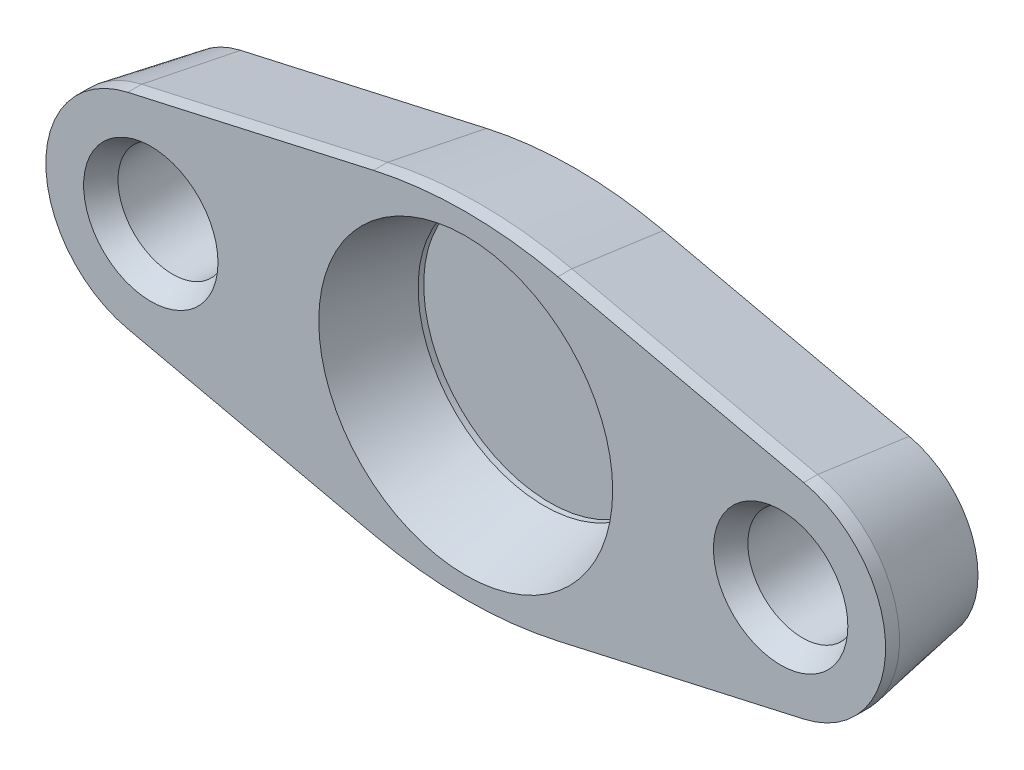
ISO-10303-21;
HEADER;
FILE_DESCRIPTION(('STEP AP214'),'2;1');
FILE_NAME('part.step','',(''),(''),'','','');
FILE_SCHEMA(('AUTOMOTIVE_DESIGN { 1 0 10303 214 1 1 1 1 }'));
ENDSEC;
DATA;
#1=APPLICATION_CONTEXT('core data for automotive mechanical design processes');
#2=APPLICATION_PROTOCOL_DEFINITION('international standard','automotive_design',2000,#1);
#3=PRODUCT_CONTEXT('',#1,'mechanical');
#4=PRODUCT('Part','Part','',(#3));
#5=PRODUCT_RELATED_PRODUCT_CATEGORY('part','',(#4));
#6=PRODUCT_DEFINITION_FORMATION('','',#4);
#7=PRODUCT_DEFINITION_CONTEXT('part definition',#1,'design');
#8=PRODUCT_DEFINITION('design','',#6,#7);
#9=PRODUCT_DEFINITION_SHAPE('','',#8);
#10=(LENGTH_UNIT() NAMED_UNIT(*) SI_UNIT(.MILLI.,.METRE.));
#11=(NAMED_UNIT(*) PLANE_ANGLE_UNIT() SI_UNIT($,.RADIAN.));
#12=(NAMED_UNIT(*) SI_UNIT($,.STERADIAN.) SOLID_ANGLE_UNIT());
#13=UNCERTAINTY_MEASURE_WITH_UNIT(LENGTH_MEASURE(1.E-05),#10,'distance_accuracy_value','');
#14=(GEOMETRIC_REPRESENTATION_CONTEXT(3) GLOBAL_UNCERTAINTY_ASSIGNED_CONTEXT((#13)) GLOBAL_UNIT_ASSIGNED_CONTEXT((#10,
#11,#12)) REPRESENTATION_CONTEXT('',''));
#15=CARTESIAN_POINT('',(0.,0.,0.));
#16=DIRECTION('',(0.,0.,1.));
#17=DIRECTION('',(1.,0.,0.));
#18=AXIS2_PLACEMENT_3D('',#15,#16,#17);
#19=CARTESIAN_POINT('',(-7.5,0.,2.6));
#20=DIRECTION('',(0.,0.,1.));
#21=DIRECTION('',(1.,0.,0.));
#22=AXIS2_PLACEMENT_3D('',#19,#20,#21);
#23=PLANE('',#22);
#24=CARTESIAN_POINT('',(7.5,0.,2.6));
#25=DIRECTION('',(0.,0.,1.));
#26=DIRECTION('',(1.,0.,0.));
#27=AXIS2_PLACEMENT_3D('',#24,#25,#26);
#28=CIRCLE('',#27,1.6);
#29=CARTESIAN_POINT('',(9.1,0.,2.6));
#30=VERTEX_POINT('',#29);
#31=EDGE_CURVE('E41',#30,#30,#28,.F.);
#32=ORIENTED_EDGE('',*,*,#31,.T.);
#33=EDGE_LOOP('',(#32));
#34=FACE_BOUND('',#33,.T.);
#35=CARTESIAN_POINT('',(-7.5,0.,2.6));
#36=DIRECTION('',(0.,0.,1.));
#37=DIRECTION('',(1.,0.,0.));
#38=AXIS2_PLACEMENT_3D('',#35,#36,#37);
#39=CIRCLE('',#38,1.6);
#40=CARTESIAN_POINT('',(-5.9,0.,2.6));
#41=VERTEX_POINT('',#40);
#42=EDGE_CURVE('E216',#41,#41,#39,.F.);
#43=ORIENTED_EDGE('',*,*,#42,.T.);
#44=EDGE_LOOP('',(#43));
#45=FACE_BOUND('',#44,.T.);
#46=CARTESIAN_POINT('',(0.,0.,2.6));
#47=DIRECTION('',(0.,0.,1.));
#48=DIRECTION('',(1.,0.,0.));
#49=AXIS2_PLACEMENT_3D('',#46,#47,#48);
#50=CIRCLE('',#49,3.5);
#51=CARTESIAN_POINT('',(3.5,0.,2.6));
#52=VERTEX_POINT('',#51);
#53=EDGE_CURVE('E210',#52,#52,#50,.F.);
#54=ORIENTED_EDGE('',*,*,#53,.T.);
#55=EDGE_LOOP('',(#54));
#56=FACE_BOUND('',#55,.T.);
#57=CARTESIAN_POINT('',(-7.5,0.,2.6));
#58=DIRECTION('',(0.,0.,1.));
#59=DIRECTION('',(1.,0.,0.));
#60=AXIS2_PLACEMENT_3D('',#57,#58,#59);
#61=CIRCLE('',#60,2.5);
#62=CARTESIAN_POINT('',(-8.04878048780488,2.4390243902439,2.6));
#63=VERTEX_POINT('',#62);
#64=CARTESIAN_POINT('',(-8.04878048780488,-2.4390243902439,2.6));
#65=VERTEX_POINT('',#64);
#66=EDGE_CURVE('E135',#63,#65,#61,.T.);
#67=ORIENTED_EDGE('',*,*,#66,.T.);
#68=DIRECTION('',(0.975609756097561,-0.219512195121951,0.));
#69=VECTOR('',#68,1.);
#70=CARTESIAN_POINT('',(-8.04878048780488,-2.4390243902439,2.6));
#71=LINE('',#70,#69);
#72=CARTESIAN_POINT('',(-2.19512195121951,-3.75609756097561,2.6));
#73=VERTEX_POINT('',#72);
#74=EDGE_CURVE('E125',#65,#73,#71,.T.);
#75=ORIENTED_EDGE('',*,*,#74,.T.);
#76=CARTESIAN_POINT('',(0.,6.,2.6));
#77=DIRECTION('',(0.,0.,1.));
#78=DIRECTION('',(1.,0.,0.));
#79=AXIS2_PLACEMENT_3D('',#76,#77,#78);
#80=CIRCLE('',#79,10.);
#81=CARTESIAN_POINT('',(2.19512195121951,-3.75609756097561,2.6));
#82=VERTEX_POINT('',#81);
#83=EDGE_CURVE('E134',#73,#82,#80,.T.);
#84=ORIENTED_EDGE('',*,*,#83,.T.);
#85=DIRECTION('',(0.975609756097561,0.219512195121951,0.));
#86=VECTOR('',#85,1.);
#87=CARTESIAN_POINT('',(2.19512195121951,-3.75609756097561,2.6));
#88=LINE('',#87,#86);
#89=CARTESIAN_POINT('',(8.04878048780488,-2.4390243902439,2.6));
#90=VERTEX_POINT('',#89);
#91=EDGE_CURVE('E245',#82,#90,#88,.T.);
#92=ORIENTED_EDGE('',*,*,#91,.T.);
#93=CARTESIAN_POINT('',(7.5,0.,2.6));
#94=DIRECTION('',(0.,0.,1.));
#95=DIRECTION('',(1.,0.,0.));
#96=AXIS2_PLACEMENT_3D('',#93,#94,#95);
#97=CIRCLE('',#96,2.5);
#98=CARTESIAN_POINT('',(8.04878048780488,2.43902439024391,2.6));
#99=VERTEX_POINT('',#98);
#100=EDGE_CURVE('E247',#90,#99,#97,.T.);
#101=ORIENTED_EDGE('',*,*,#100,.T.);
#102=DIRECTION('',(-0.975609756097561,0.219512195121951,0.));
#103=VECTOR('',#102,1.);
#104=CARTESIAN_POINT('',(2.19512195121951,3.75609756097561,2.6));
#105=LINE('',#104,#103);
#106=CARTESIAN_POINT('',(2.19512195121951,3.75609756097561,2.6));
#107=VERTEX_POINT('',#106);
#108=EDGE_CURVE('E249',#99,#107,#105,.T.);
#109=ORIENTED_EDGE('',*,*,#108,.T.);
#110=CARTESIAN_POINT('',(0.,-6.,2.6));
#111=DIRECTION('',(0.,0.,1.));
#112=DIRECTION('',(-1.,0.,0.));
#113=AXIS2_PLACEMENT_3D('',#110,#111,#112);
#114=CIRCLE('',#113,10.);
#115=CARTESIAN_POINT('',(-2.19512195121951,3.75609756097561,2.6));
#116=VERTEX_POINT('',#115);
#117=EDGE_CURVE('E251',#107,#116,#114,.T.);
#118=ORIENTED_EDGE('',*,*,#117,.T.);
#119=DIRECTION('',(-0.975609756097561,-0.219512195121951,0.));
#120=VECTOR('',#119,1.);
#121=CARTESIAN_POINT('',(-8.04878048780488,2.4390243902439,2.6));
#122=LINE('',#121,#120);
#123=EDGE_CURVE('E139',#116,#63,#122,.T.);
#124=ORIENTED_EDGE('',*,*,#123,.T.);
#125=EDGE_LOOP('',(#67,#75,#84,#92,#101,#109,#118,#124));
#126=FACE_BOUND('',#125,.T.);
#127=ADVANCED_FACE('F33',(#34,#45,#56,#126),#23,.T.);
#128=CARTESIAN_POINT('',(-7.5,0.,0.));
#129=DIRECTION('',(0.,0.,1.));
#130=DIRECTION('',(1.,0.,0.));
#131=AXIS2_PLACEMENT_3D('',#128,#129,#130);
#132=PLANE('',#131);
#133=CARTESIAN_POINT('',(-7.5,0.,0.));
#134=DIRECTION('',(0.,0.,1.));
#135=DIRECTION('',(1.,0.,0.));
#136=AXIS2_PLACEMENT_3D('',#133,#134,#135);
#137=CIRCLE('',#136,2.1);
#138=CARTESIAN_POINT('',(-7.9609756097561,-2.04878048780488,0.));
#139=VERTEX_POINT('',#138);
#140=CARTESIAN_POINT('',(-7.9609756097561,2.04878048780488,0.));
#141=VERTEX_POINT('',#140);
#142=EDGE_CURVE('E168',#139,#141,#137,.F.);
#143=ORIENTED_EDGE('',*,*,#142,.T.);
#144=DIRECTION('',(0.975609756097561,0.219512195121951,0.));
#145=VECTOR('',#144,1.);
#146=CARTESIAN_POINT('',(-7.9609756097561,2.04878048780488,0.));
#147=LINE('',#146,#145);
#148=CARTESIAN_POINT('',(-2.10731707317073,3.36585365853658,0.));
#149=VERTEX_POINT('',#148);
#150=EDGE_CURVE('E170',#141,#149,#147,.T.);
#151=ORIENTED_EDGE('',*,*,#150,.T.);
#152=CARTESIAN_POINT('',(0.,-6.,0.));
#153=DIRECTION('',(0.,0.,1.));
#154=DIRECTION('',(1.,0.,0.));
#155=AXIS2_PLACEMENT_3D('',#152,#153,#154);
#156=CIRCLE('',#155,9.6);
#157=CARTESIAN_POINT('',(2.10731707317073,3.36585365853659,0.));
#158=VERTEX_POINT('',#157);
#159=EDGE_CURVE('E166',#149,#158,#156,.F.);
#160=ORIENTED_EDGE('',*,*,#159,.T.);
#161=DIRECTION('',(0.975609756097561,-0.219512195121951,0.));
#162=VECTOR('',#161,1.);
#163=CARTESIAN_POINT('',(-6.31624033313504,5.26115407495538,0.));
#164=LINE('',#163,#162);
#165=CARTESIAN_POINT('',(7.9609756097561,2.04878048780488,0.));
#166=VERTEX_POINT('',#165);
#167=EDGE_CURVE('E162',#158,#166,#164,.T.);
#168=ORIENTED_EDGE('',*,*,#167,.T.);
#169=CARTESIAN_POINT('',(7.5,0.,0.));
#170=DIRECTION('',(0.,0.,1.));
#171=DIRECTION('',(1.,0.,0.));
#172=AXIS2_PLACEMENT_3D('',#169,#170,#171);
#173=CIRCLE('',#172,2.1);
#174=CARTESIAN_POINT('',(7.9609756097561,-2.04878048780488,0.));
#175=VERTEX_POINT('',#174);
#176=EDGE_CURVE('E158',#166,#175,#173,.F.);
#177=ORIENTED_EDGE('',*,*,#176,.T.);
#178=DIRECTION('',(-0.975609756097561,-0.219512195121951,0.));
#179=VECTOR('',#178,1.);
#180=CARTESIAN_POINT('',(-6.31624033313504,-5.26115407495539,0.));
#181=LINE('',#180,#179);
#182=CARTESIAN_POINT('',(2.10731707317073,-3.36585365853659,0.));
#183=VERTEX_POINT('',#182);
#184=EDGE_CURVE('E151',#175,#183,#181,.T.);
#185=ORIENTED_EDGE('',*,*,#184,.T.);
#186=CARTESIAN_POINT('',(0.,6.,0.));
#187=DIRECTION('',(0.,0.,1.));
#188=DIRECTION('',(1.,0.,0.));
#189=AXIS2_PLACEMENT_3D('',#186,#187,#188);
#190=CIRCLE('',#189,9.6);
#191=CARTESIAN_POINT('',(-2.10731707317073,-3.36585365853659,0.));
#192=VERTEX_POINT('',#191);
#193=EDGE_CURVE('E160',#183,#192,#190,.F.);
#194=ORIENTED_EDGE('',*,*,#193,.T.);
#195=DIRECTION('',(-0.975609756097561,0.219512195121951,0.));
#196=VECTOR('',#195,1.);
#197=CARTESIAN_POINT('',(-7.9609756097561,-2.04878048780488,0.));
#198=LINE('',#197,#196);
#199=EDGE_CURVE('E164',#192,#139,#198,.T.);
#200=ORIENTED_EDGE('',*,*,#199,.T.);
#201=EDGE_LOOP('',(#143,#151,#160,#168,#177,#185,#194,#200));
#202=FACE_BOUND('',#201,.T.);
#203=CARTESIAN_POINT('',(7.5,0.,0.));
#204=DIRECTION('',(0.,0.,1.));
#205=DIRECTION('',(1.,0.,0.));
#206=AXIS2_PLACEMENT_3D('',#203,#204,#205);
#207=CIRCLE('',#206,1.3);
#208=CARTESIAN_POINT('',(8.8,0.,0.));
#209=VERTEX_POINT('',#208);
#210=EDGE_CURVE('E143',#209,#209,#207,.T.);
#211=ORIENTED_EDGE('',*,*,#210,.T.);
#212=EDGE_LOOP('',(#211));
#213=FACE_BOUND('',#212,.T.);
#214=CARTESIAN_POINT('',(-7.5,0.,0.));
#215=DIRECTION('',(0.,0.,1.));
#216=DIRECTION('',(1.,0.,0.));
#217=AXIS2_PLACEMENT_3D('',#214,#215,#216);
#218=CIRCLE('',#217,1.3);
#219=CARTESIAN_POINT('',(-6.2,0.,0.));
#220=VERTEX_POINT('',#219);
#221=EDGE_CURVE('E238',#220,#220,#218,.T.);
#222=ORIENTED_EDGE('',*,*,#221,.T.);
#223=EDGE_LOOP('',(#222));
#224=FACE_BOUND('',#223,.T.);
#225=ADVANCED_FACE('F280',(#202,#213,#224),#132,.F.);
#226=CARTESIAN_POINT('',(-7.5,0.,2.6));
#227=DIRECTION('',(0.,0.,-1.));
#228=DIRECTION('',(-1.,0.,0.));
#229=AXIS2_PLACEMENT_3D('',#226,#227,#228);
#230=CYLINDRICAL_SURFACE('',#229,2.5);
#231=DIRECTION('',(0.,0.,-1.));
#232=VECTOR('',#231,1.);
#233=CARTESIAN_POINT('',(-8.04878048780488,2.4390243902439,2.6));
#234=LINE('',#233,#232);
#235=CARTESIAN_POINT('',(-8.04878048780488,2.4390243902439,2.26851272784708));
#236=VERTEX_POINT('',#235);
#237=EDGE_CURVE('E254',#63,#236,#234,.T.);
#238=ORIENTED_EDGE('',*,*,#237,.T.);
#239=CARTESIAN_POINT('',(-7.5,0.,2.26851272784708));
#240=DIRECTION('',(0.,0.,1.));
#241=DIRECTION('',(1.,0.,0.));
#242=AXIS2_PLACEMENT_3D('',#239,#240,#241);
#243=CIRCLE('',#242,2.5);
#244=CARTESIAN_POINT('',(-8.04878048780488,-2.4390243902439,2.26851272784708));
#245=VERTEX_POINT('',#244);
#246=EDGE_CURVE('E147',#236,#245,#243,.T.);
#247=ORIENTED_EDGE('',*,*,#246,.T.);
#248=DIRECTION('',(0.,0.,-1.));
#249=VECTOR('',#248,1.);
#250=CARTESIAN_POINT('',(-8.04878048780488,-2.4390243902439,2.6));
#251=LINE('',#250,#249);
#252=EDGE_CURVE('E129',#65,#245,#251,.T.);
#253=ORIENTED_EDGE('',*,*,#252,.F.);
#254=ORIENTED_EDGE('',*,*,#66,.F.);
#255=EDGE_LOOP('',(#238,#247,#253,#254));
#256=FACE_BOUND('',#255,.T.);
#257=ADVANCED_FACE('F145',(#256),#230,.T.);
#258=CARTESIAN_POINT('',(-8.04878048780488,-2.4390243902439,2.6));
#259=DIRECTION('',(0.219512195121951,0.975609756097561,0.));
#260=DIRECTION('',(-0.975609756097561,0.219512195121951,0.));
#261=AXIS2_PLACEMENT_3D('',#258,#259,#260);
#262=PLANE('',#261);
#263=ORIENTED_EDGE('',*,*,#252,.T.);
#264=DIRECTION('',(0.975609756097561,-0.219512195121951,0.));
#265=VECTOR('',#264,1.);
#266=CARTESIAN_POINT('',(-8.04878048780488,-2.4390243902439,2.26851272784708));
#267=LINE('',#266,#265);
#268=CARTESIAN_POINT('',(-2.19512195121951,-3.75609756097561,2.26851272784708));
#269=VERTEX_POINT('',#268);
#270=EDGE_CURVE('E176',#245,#269,#267,.T.);
#271=ORIENTED_EDGE('',*,*,#270,.T.);
#272=DIRECTION('',(0.,0.,-1.));
#273=VECTOR('',#272,1.);
#274=CARTESIAN_POINT('',(-2.19512195121951,-3.75609756097561,2.6));
#275=LINE('',#274,#273);
#276=EDGE_CURVE('E131',#73,#269,#275,.T.);
#277=ORIENTED_EDGE('',*,*,#276,.F.);
#278=ORIENTED_EDGE('',*,*,#74,.F.);
#279=EDGE_LOOP('',(#263,#271,#277,#278));
#280=FACE_BOUND('',#279,.T.);
#281=ADVANCED_FACE('F127',(#280),#262,.F.);
#282=CARTESIAN_POINT('',(0.,6.,2.6));
#283=DIRECTION('',(0.,0.,-1.));
#284=DIRECTION('',(-1.,0.,0.));
#285=AXIS2_PLACEMENT_3D('',#282,#283,#284);
#286=CYLINDRICAL_SURFACE('',#285,10.);
#287=ORIENTED_EDGE('',*,*,#276,.T.);
#288=CARTESIAN_POINT('',(0.,6.,2.26851272784708));
#289=DIRECTION('',(0.,0.,1.));
#290=DIRECTION('',(1.,0.,0.));
#291=AXIS2_PLACEMENT_3D('',#288,#289,#290);
#292=CIRCLE('',#291,10.);
#293=CARTESIAN_POINT('',(2.19512195121951,-3.75609756097561,2.26851272784708));
#294=VERTEX_POINT('',#293);
#295=EDGE_CURVE('E56',#269,#294,#292,.T.);
#296=ORIENTED_EDGE('',*,*,#295,.T.);
#297=DIRECTION('',(0.,0.,-1.));
#298=VECTOR('',#297,1.);
#299=CARTESIAN_POINT('',(2.19512195121951,-3.75609756097561,2.6));
#300=LINE('',#299,#298);
#301=EDGE_CURVE('E153',#82,#294,#300,.T.);
#302=ORIENTED_EDGE('',*,*,#301,.F.);
#303=ORIENTED_EDGE('',*,*,#83,.F.);
#304=EDGE_LOOP('',(#287,#296,#302,#303));
#305=FACE_BOUND('',#304,.T.);
#306=ADVANCED_FACE('F297',(#305),#286,.T.);
#307=CARTESIAN_POINT('',(2.19512195121951,-3.75609756097561,2.6));
#308=DIRECTION('',(-0.219512195121951,0.975609756097561,0.));
#309=DIRECTION('',(-0.975609756097561,-0.219512195121951,0.));
#310=AXIS2_PLACEMENT_3D('',#307,#308,#309);
#311=PLANE('',#310);
#312=ORIENTED_EDGE('',*,*,#301,.T.);
#313=DIRECTION('',(0.975609756097561,0.219512195121951,0.));
#314=VECTOR('',#313,1.);
#315=CARTESIAN_POINT('',(2.19512195121951,-3.75609756097561,2.26851272784708));
#316=LINE('',#315,#314);
#317=CARTESIAN_POINT('',(8.04878048780488,-2.4390243902439,2.26851272784708));
#318=VERTEX_POINT('',#317);
#319=EDGE_CURVE('E48',#294,#318,#316,.T.);
#320=ORIENTED_EDGE('',*,*,#319,.T.);
#321=DIRECTION('',(0.,0.,-1.));
#322=VECTOR('',#321,1.);
#323=CARTESIAN_POINT('',(8.04878048780488,-2.4390243902439,2.6));
#324=LINE('',#323,#322);
#325=EDGE_CURVE('E265',#90,#318,#324,.T.);
#326=ORIENTED_EDGE('',*,*,#325,.F.);
#327=ORIENTED_EDGE('',*,*,#91,.F.);
#328=EDGE_LOOP('',(#312,#320,#326,#327));
#329=FACE_BOUND('',#328,.T.);
#330=ADVANCED_FACE('F267',(#329),#311,.F.);
#331=CARTESIAN_POINT('',(7.5,0.,2.6));
#332=DIRECTION('',(0.,0.,-1.));
#333=DIRECTION('',(-1.,0.,0.));
#334=AXIS2_PLACEMENT_3D('',#331,#332,#333);
#335=CYLINDRICAL_SURFACE('',#334,2.5);
#336=ORIENTED_EDGE('',*,*,#325,.T.);
#337=CARTESIAN_POINT('',(7.5,0.,2.26851272784708));
#338=DIRECTION('',(0.,0.,1.));
#339=DIRECTION('',(1.,0.,0.));
#340=AXIS2_PLACEMENT_3D('',#337,#338,#339);
#341=CIRCLE('',#340,2.5);
#342=CARTESIAN_POINT('',(8.04878048780488,2.43902439024391,2.26851272784708));
#343=VERTEX_POINT('',#342);
#344=EDGE_CURVE('E181',#318,#343,#341,.T.);
#345=ORIENTED_EDGE('',*,*,#344,.T.);
#346=DIRECTION('',(0.,0.,-1.));
#347=VECTOR('',#346,1.);
#348=CARTESIAN_POINT('',(8.04878048780488,2.43902439024391,2.6));
#349=LINE('',#348,#347);
#350=EDGE_CURVE('E262',#99,#343,#349,.T.);
#351=ORIENTED_EDGE('',*,*,#350,.F.);
#352=ORIENTED_EDGE('',*,*,#100,.F.);
#353=EDGE_LOOP('',(#336,#345,#351,#352));
#354=FACE_BOUND('',#353,.T.);
#355=ADVANCED_FACE('F289',(#354),#335,.T.);
#356=CARTESIAN_POINT('',(2.19512195121951,3.75609756097561,2.6));
#357=DIRECTION('',(-0.219512195121951,-0.975609756097561,0.));
#358=DIRECTION('',(0.975609756097561,-0.219512195121951,0.));
#359=AXIS2_PLACEMENT_3D('',#356,#357,#358);
#360=PLANE('',#359);
#361=ORIENTED_EDGE('',*,*,#350,.T.);
#362=DIRECTION('',(-0.975609756097561,0.219512195121951,0.));
#363=VECTOR('',#362,1.);
#364=CARTESIAN_POINT('',(2.19512195121951,3.75609756097561,2.26851272784708));
#365=LINE('',#364,#363);
#366=CARTESIAN_POINT('',(2.19512195121951,3.75609756097561,2.26851272784708));
#367=VERTEX_POINT('',#366);
#368=EDGE_CURVE('E178',#343,#367,#365,.T.);
#369=ORIENTED_EDGE('',*,*,#368,.T.);
#370=DIRECTION('',(0.,0.,-1.));
#371=VECTOR('',#370,1.);
#372=CARTESIAN_POINT('',(2.19512195121951,3.75609756097561,2.6));
#373=LINE('',#372,#371);
#374=EDGE_CURVE('E259',#107,#367,#373,.T.);
#375=ORIENTED_EDGE('',*,*,#374,.F.);
#376=ORIENTED_EDGE('',*,*,#108,.F.);
#377=EDGE_LOOP('',(#361,#369,#375,#376));
#378=FACE_BOUND('',#377,.T.);
#379=ADVANCED_FACE('F293',(#378),#360,.F.);
#380=CARTESIAN_POINT('',(0.,-6.,2.6));
#381=DIRECTION('',(0.,0.,-1.));
#382=DIRECTION('',(-1.,0.,0.));
#383=AXIS2_PLACEMENT_3D('',#380,#381,#382);
#384=CYLINDRICAL_SURFACE('',#383,10.);
#385=ORIENTED_EDGE('',*,*,#374,.T.);
#386=CARTESIAN_POINT('',(0.,-6.,2.26851272784708));
#387=DIRECTION('',(0.,0.,1.));
#388=DIRECTION('',(1.,0.,0.));
#389=AXIS2_PLACEMENT_3D('',#386,#387,#388);
#390=CIRCLE('',#389,10.);
#391=CARTESIAN_POINT('',(-2.19512195121951,3.75609756097561,2.26851272784708));
#392=VERTEX_POINT('',#391);
#393=EDGE_CURVE('E174',#367,#392,#390,.T.);
#394=ORIENTED_EDGE('',*,*,#393,.T.);
#395=DIRECTION('',(0.,0.,-1.));
#396=VECTOR('',#395,1.);
#397=CARTESIAN_POINT('',(-2.19512195121951,3.75609756097561,2.6));
#398=LINE('',#397,#396);
#399=EDGE_CURVE('E256',#116,#392,#398,.T.);
#400=ORIENTED_EDGE('',*,*,#399,.F.);
#401=ORIENTED_EDGE('',*,*,#117,.F.);
#402=EDGE_LOOP('',(#385,#394,#400,#401));
#403=FACE_BOUND('',#402,.T.);
#404=ADVANCED_FACE('F316',(#403),#384,.T.);
#405=CARTESIAN_POINT('',(-8.04878048780488,2.4390243902439,2.6));
#406=DIRECTION('',(0.219512195121951,-0.975609756097561,0.));
#407=DIRECTION('',(0.975609756097561,0.219512195121951,0.));
#408=AXIS2_PLACEMENT_3D('',#405,#406,#407);
#409=PLANE('',#408);
#410=ORIENTED_EDGE('',*,*,#399,.T.);
#411=DIRECTION('',(-0.975609756097561,-0.219512195121951,0.));
#412=VECTOR('',#411,1.);
#413=CARTESIAN_POINT('',(-8.04878048780488,2.4390243902439,2.26851272784708));
#414=LINE('',#413,#412);
#415=EDGE_CURVE('E148',#392,#236,#414,.T.);
#416=ORIENTED_EDGE('',*,*,#415,.T.);
#417=ORIENTED_EDGE('',*,*,#237,.F.);
#418=ORIENTED_EDGE('',*,*,#123,.F.);
#419=EDGE_LOOP('',(#410,#416,#417,#418));
#420=FACE_BOUND('',#419,.T.);
#421=ADVANCED_FACE('F233',(#420),#409,.F.);
#422=CARTESIAN_POINT('',(7.5,0.,2.6));
#423=DIRECTION('',(0.,0.,-1.));
#424=DIRECTION('',(-1.,0.,0.));
#425=AXIS2_PLACEMENT_3D('',#422,#423,#424);
#426=CYLINDRICAL_SURFACE('',#425,1.3);
#427=CARTESIAN_POINT('',(7.5,0.,2.08038475772933));
#428=DIRECTION('',(0.,0.,1.));
#429=DIRECTION('',(1.,0.,0.));
#430=AXIS2_PLACEMENT_3D('',#427,#428,#429);
#431=CIRCLE('',#430,1.3);
#432=CARTESIAN_POINT('',(8.8,0.,2.08038475772933));
#433=VERTEX_POINT('',#432);
#434=EDGE_CURVE('E213',#433,#433,#431,.T.);
#435=ORIENTED_EDGE('',*,*,#434,.T.);
#436=EDGE_LOOP('',(#435));
#437=FACE_BOUND('',#436,.T.);
#438=ORIENTED_EDGE('',*,*,#210,.F.);
#439=EDGE_LOOP('',(#438));
#440=FACE_BOUND('',#439,.T.);
#441=ADVANCED_FACE('F229',(#437,#440),#426,.F.);
#442=CARTESIAN_POINT('',(-7.5,0.,2.6));
#443=DIRECTION('',(0.,0.,-1.));
#444=DIRECTION('',(-1.,0.,0.));
#445=AXIS2_PLACEMENT_3D('',#442,#443,#444);
#446=CYLINDRICAL_SURFACE('',#445,1.3);
#447=CARTESIAN_POINT('',(-7.5,0.,2.08038475772934));
#448=DIRECTION('',(0.,0.,1.));
#449=DIRECTION('',(1.,0.,0.));
#450=AXIS2_PLACEMENT_3D('',#447,#448,#449);
#451=CIRCLE('',#450,1.3);
#452=CARTESIAN_POINT('',(-6.2,0.,2.08038475772934));
#453=VERTEX_POINT('',#452);
#454=EDGE_CURVE('E11',#453,#453,#451,.T.);
#455=ORIENTED_EDGE('',*,*,#454,.T.);
#456=EDGE_LOOP('',(#455));
#457=FACE_BOUND('',#456,.T.);
#458=ORIENTED_EDGE('',*,*,#221,.F.);
#459=EDGE_LOOP('',(#458));
#460=FACE_BOUND('',#459,.T.);
#461=ADVANCED_FACE('F232',(#457,#460),#446,.F.);
#462=CARTESIAN_POINT('',(0.,0.,0.6));
#463=DIRECTION('',(0.,0.,1.));
#464=DIRECTION('',(1.,0.,0.));
#465=AXIS2_PLACEMENT_3D('',#462,#463,#464);
#466=CYLINDRICAL_SURFACE('',#465,3.);
#467=CARTESIAN_POINT('',(0.,0.,0.733974596215572));
#468=DIRECTION('',(0.,0.,1.));
#469=DIRECTION('',(1.,0.,0.));
#470=AXIS2_PLACEMENT_3D('',#467,#468,#469);
#471=CIRCLE('',#470,3.);
#472=CARTESIAN_POINT('',(3.,0.,0.733974596215572));
#473=VERTEX_POINT('',#472);
#474=EDGE_CURVE('E184',#473,#473,#471,.T.);
#475=ORIENTED_EDGE('',*,*,#474,.T.);
#476=EDGE_LOOP('',(#475));
#477=FACE_BOUND('',#476,.T.);
#478=CARTESIAN_POINT('',(0.,0.,0.6));
#479=DIRECTION('',(0.,0.,1.));
#480=DIRECTION('',(1.,0.,0.));
#481=AXIS2_PLACEMENT_3D('',#478,#479,#480);
#482=CIRCLE('',#481,3.);
#483=CARTESIAN_POINT('',(3.,0.,0.6));
#484=VERTEX_POINT('',#483);
#485=EDGE_CURVE('E207',#484,#484,#482,.T.);
#486=ORIENTED_EDGE('',*,*,#485,.F.);
#487=EDGE_LOOP('',(#486));
#488=FACE_BOUND('',#487,.T.);
#489=ADVANCED_FACE('F351',(#477,#488),#466,.F.);
#490=CARTESIAN_POINT('',(0.,0.,0.6));
#491=DIRECTION('',(0.,0.,1.));
#492=DIRECTION('',(1.,0.,0.));
#493=AXIS2_PLACEMENT_3D('',#490,#491,#492);
#494=PLANE('',#493);
#495=ORIENTED_EDGE('',*,*,#485,.T.);
#496=EDGE_LOOP('',(#495));
#497=FACE_BOUND('',#496,.T.);
#498=ADVANCED_FACE('F359',(#497),#494,.T.);
#499=CARTESIAN_POINT('',(2.19512195121951,-3.75609756097561,2.26851272784708));
#500=DIRECTION('',(-0.216177311636826,0.960788051719227,0.173648177666931));
#501=DIRECTION('',(0.975609756097561,0.219512195121951,0.));
#502=AXIS2_PLACEMENT_3D('',#499,#500,#501);
#503=PLANE('',#502);
#504=DIRECTION('',(0.0381178926585945,-0.16941285626042,0.984807753012208));
#505=VECTOR('',#504,1.);
#506=CARTESIAN_POINT('',(2.10731707317073,-3.36585365853659,0.));
#507=LINE('',#506,#505);
#508=EDGE_CURVE('E201',#183,#294,#507,.T.);
#509=ORIENTED_EDGE('',*,*,#508,.F.);
#510=ORIENTED_EDGE('',*,*,#184,.F.);
#511=DIRECTION('',(-0.0381178926585943,0.16941285626042,-0.984807753012208));
#512=VECTOR('',#511,1.);
#513=CARTESIAN_POINT('',(8.04878048780488,-2.4390243902439,2.26851272784708));
#514=LINE('',#513,#512);
#515=EDGE_CURVE('E204',#318,#175,#514,.T.);
#516=ORIENTED_EDGE('',*,*,#515,.F.);
#517=ORIENTED_EDGE('',*,*,#319,.F.);
#518=EDGE_LOOP('',(#509,#510,#516,#517));
#519=FACE_BOUND('',#518,.T.);
#520=ADVANCED_FACE('F271',(#519),#503,.F.);
#521=CARTESIAN_POINT('',(7.5,0.,2.26851272784708));
#522=DIRECTION('',(0.,0.,1.));
#523=DIRECTION('',(1.,0.,0.));
#524=AXIS2_PLACEMENT_3D('',#521,#522,#523);
#525=CONICAL_SURFACE('',#524,2.5,0.174532925199433);
#526=ORIENTED_EDGE('',*,*,#515,.T.);
#527=ORIENTED_EDGE('',*,*,#176,.F.);
#528=DIRECTION('',(-0.0381178926585943,-0.16941285626042,-0.984807753012208));
#529=VECTOR('',#528,1.);
#530=CARTESIAN_POINT('',(8.04878048780488,2.43902439024391,2.26851272784708));
#531=LINE('',#530,#529);
#532=EDGE_CURVE('E198',#343,#166,#531,.T.);
#533=ORIENTED_EDGE('',*,*,#532,.F.);
#534=ORIENTED_EDGE('',*,*,#344,.F.);
#535=EDGE_LOOP('',(#526,#527,#533,#534));
#536=FACE_BOUND('',#535,.T.);
#537=ADVANCED_FACE('F284',(#536),#525,.T.);
#538=CARTESIAN_POINT('',(0.,6.,2.26851272784708));
#539=DIRECTION('',(0.,0.,1.));
#540=DIRECTION('',(1.,0.,0.));
#541=AXIS2_PLACEMENT_3D('',#538,#539,#540);
#542=CONICAL_SURFACE('',#541,10.,0.174532925199433);
#543=ORIENTED_EDGE('',*,*,#508,.T.);
#544=ORIENTED_EDGE('',*,*,#295,.F.);
#545=DIRECTION('',(-0.0381178926585945,-0.16941285626042,0.984807753012208));
#546=VECTOR('',#545,1.);
#547=CARTESIAN_POINT('',(-2.10731707317073,-3.36585365853659,0.));
#548=LINE('',#547,#546);
#549=EDGE_CURVE('E195',#192,#269,#548,.T.);
#550=ORIENTED_EDGE('',*,*,#549,.F.);
#551=ORIENTED_EDGE('',*,*,#193,.F.);
#552=EDGE_LOOP('',(#543,#544,#550,#551));
#553=FACE_BOUND('',#552,.T.);
#554=ADVANCED_FACE('F276',(#553),#542,.T.);
#555=CARTESIAN_POINT('',(2.19512195121951,3.75609756097561,2.26851272784708));
#556=DIRECTION('',(-0.216177311636826,-0.960788051719228,0.17364817766693));
#557=DIRECTION('',(-0.975609756097561,0.219512195121951,0.));
#558=AXIS2_PLACEMENT_3D('',#555,#556,#557);
#559=PLANE('',#558);
#560=ORIENTED_EDGE('',*,*,#532,.T.);
#561=ORIENTED_EDGE('',*,*,#167,.F.);
#562=DIRECTION('',(-0.0381178926585945,-0.16941285626042,-0.984807753012208));
#563=VECTOR('',#562,1.);
#564=CARTESIAN_POINT('',(2.19512195121951,3.75609756097561,2.26851272784708));
#565=LINE('',#564,#563);
#566=EDGE_CURVE('E192',#367,#158,#565,.T.);
#567=ORIENTED_EDGE('',*,*,#566,.F.);
#568=ORIENTED_EDGE('',*,*,#368,.F.);
#569=EDGE_LOOP('',(#560,#561,#567,#568));
#570=FACE_BOUND('',#569,.T.);
#571=ADVANCED_FACE('F388',(#570),#559,.F.);
#572=CARTESIAN_POINT('',(-8.04878048780488,-2.4390243902439,2.26851272784708));
#573=DIRECTION('',(0.216177311636826,0.960788051719227,0.173648177666931));
#574=DIRECTION('',(0.975609756097561,-0.219512195121951,0.));
#575=AXIS2_PLACEMENT_3D('',#572,#573,#574);
#576=PLANE('',#575);
#577=ORIENTED_EDGE('',*,*,#549,.T.);
#578=ORIENTED_EDGE('',*,*,#270,.F.);
#579=DIRECTION('',(-0.0381178926585943,-0.16941285626042,0.984807753012208));
#580=VECTOR('',#579,1.);
#581=CARTESIAN_POINT('',(-7.9609756097561,-2.04878048780488,0.));
#582=LINE('',#581,#580);
#583=EDGE_CURVE('E189',#139,#245,#582,.T.);
#584=ORIENTED_EDGE('',*,*,#583,.F.);
#585=ORIENTED_EDGE('',*,*,#199,.F.);
#586=EDGE_LOOP('',(#577,#578,#584,#585));
#587=FACE_BOUND('',#586,.T.);
#588=ADVANCED_FACE('F395',(#587),#576,.F.);
#589=CARTESIAN_POINT('',(0.,-6.,2.26851272784708));
#590=DIRECTION('',(0.,0.,1.));
#591=DIRECTION('',(1.,0.,0.));
#592=AXIS2_PLACEMENT_3D('',#589,#590,#591);
#593=CONICAL_SURFACE('',#592,10.,0.174532925199434);
#594=ORIENTED_EDGE('',*,*,#566,.T.);
#595=ORIENTED_EDGE('',*,*,#159,.F.);
#596=DIRECTION('',(0.0381178926585947,-0.169412856260421,-0.984807753012208));
#597=VECTOR('',#596,1.);
#598=CARTESIAN_POINT('',(-2.19512195121951,3.75609756097561,2.26851272784708));
#599=LINE('',#598,#597);
#600=EDGE_CURVE('E187',#392,#149,#599,.T.);
#601=ORIENTED_EDGE('',*,*,#600,.F.);
#602=ORIENTED_EDGE('',*,*,#393,.F.);
#603=EDGE_LOOP('',(#594,#595,#601,#602));
#604=FACE_BOUND('',#603,.T.);
#605=ADVANCED_FACE('F403',(#604),#593,.T.);
#606=CARTESIAN_POINT('',(-7.5,0.,2.26851272784708));
#607=DIRECTION('',(0.,0.,1.));
#608=DIRECTION('',(1.,0.,0.));
#609=AXIS2_PLACEMENT_3D('',#606,#607,#608);
#610=CONICAL_SURFACE('',#609,2.5,0.174532925199433);
#611=ORIENTED_EDGE('',*,*,#583,.T.);
#612=ORIENTED_EDGE('',*,*,#246,.F.);
#613=DIRECTION('',(-0.0381178926585943,0.16941285626042,0.984807753012208));
#614=VECTOR('',#613,1.);
#615=CARTESIAN_POINT('',(-7.9609756097561,2.04878048780488,0.));
#616=LINE('',#615,#614);
#617=EDGE_CURVE('E185',#141,#236,#616,.T.);
#618=ORIENTED_EDGE('',*,*,#617,.F.);
#619=ORIENTED_EDGE('',*,*,#142,.F.);
#620=EDGE_LOOP('',(#611,#612,#618,#619));
#621=FACE_BOUND('',#620,.T.);
#622=ADVANCED_FACE('F411',(#621),#610,.T.);
#623=CARTESIAN_POINT('',(-8.04878048780488,2.4390243902439,2.26851272784708));
#624=DIRECTION('',(0.216177311636826,-0.960788051719227,0.17364817766693));
#625=DIRECTION('',(-0.975609756097561,-0.219512195121951,0.));
#626=AXIS2_PLACEMENT_3D('',#623,#624,#625);
#627=PLANE('',#626);
#628=ORIENTED_EDGE('',*,*,#600,.T.);
#629=ORIENTED_EDGE('',*,*,#150,.F.);
#630=ORIENTED_EDGE('',*,*,#617,.T.);
#631=ORIENTED_EDGE('',*,*,#415,.F.);
#632=EDGE_LOOP('',(#628,#629,#630,#631));
#633=FACE_BOUND('',#632,.T.);
#634=ADVANCED_FACE('F419',(#633),#627,.F.);
#635=CARTESIAN_POINT('',(0.,0.,0.733974596215572));
#636=DIRECTION('',(0.,0.,1.));
#637=DIRECTION('',(1.,0.,0.));
#638=AXIS2_PLACEMENT_3D('',#635,#636,#637);
#639=CONICAL_SURFACE('',#638,3.,0.26179938779915);
#640=ORIENTED_EDGE('',*,*,#53,.F.);
#641=EDGE_LOOP('',(#640));
#642=FACE_BOUND('',#641,.T.);
#643=ORIENTED_EDGE('',*,*,#474,.F.);
#644=EDGE_LOOP('',(#643));
#645=FACE_BOUND('',#644,.T.);
#646=ADVANCED_FACE('F226',(#642,#645),#639,.F.);
#647=CARTESIAN_POINT('',(7.5,0.,2.08038475772933));
#648=DIRECTION('',(0.,0.,1.));
#649=DIRECTION('',(1.,0.,0.));
#650=AXIS2_PLACEMENT_3D('',#647,#648,#649);
#651=CONICAL_SURFACE('',#650,1.3,0.523598775598301);
#652=ORIENTED_EDGE('',*,*,#31,.F.);
#653=EDGE_LOOP('',(#652));
#654=FACE_BOUND('',#653,.T.);
#655=ORIENTED_EDGE('',*,*,#434,.F.);
#656=EDGE_LOOP('',(#655));
#657=FACE_BOUND('',#656,.T.);
#658=ADVANCED_FACE('F223',(#654,#657),#651,.F.);
#659=CARTESIAN_POINT('',(-7.5,0.,2.08038475772934));
#660=DIRECTION('',(0.,0.,1.));
#661=DIRECTION('',(1.,0.,0.));
#662=AXIS2_PLACEMENT_3D('',#659,#660,#661);
#663=CONICAL_SURFACE('',#662,1.3,0.523598775598301);
#664=ORIENTED_EDGE('',*,*,#42,.F.);
#665=EDGE_LOOP('',(#664));
#666=FACE_BOUND('',#665,.T.);
#667=ORIENTED_EDGE('',*,*,#454,.F.);
#668=EDGE_LOOP('',(#667));
#669=FACE_BOUND('',#668,.T.);
#670=ADVANCED_FACE('F35',(#666,#669),#663,.F.);
#671=CLOSED_SHELL('',(#127,#225,#257,#281,#306,#330,#355,#379,#404,#421,#441,#461,#489,#498,
#520,#537,#554,#571,#588,#605,#622,#634,#646,#658,#670));
#672=MANIFOLD_SOLID_BREP('B2',#671);
#673=ADVANCED_BREP_SHAPE_REPRESENTATION('',(#18,#672),#14);
#674=SHAPE_DEFINITION_REPRESENTATION(#9,#673);
ENDSEC;
END-ISO-10303-21;
